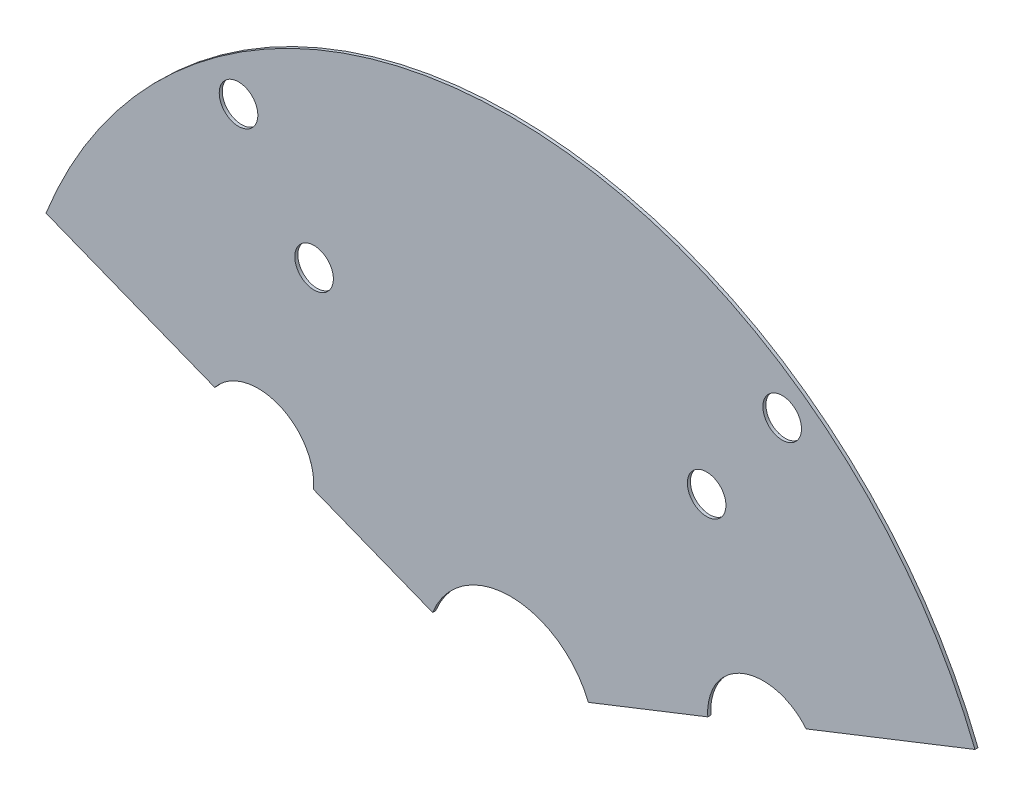
ISO-10303-21;
HEADER;
FILE_DESCRIPTION(('STEP AP214'),'2;1');
FILE_NAME('part.step','',(''),(''),'','','');
FILE_SCHEMA(('AUTOMOTIVE_DESIGN { 1 0 10303 214 1 1 1 1 }'));
ENDSEC;
DATA;
#1=APPLICATION_CONTEXT('core data for automotive mechanical design processes');
#2=APPLICATION_PROTOCOL_DEFINITION('international standard','automotive_design',2000,#1);
#3=PRODUCT_CONTEXT('',#1,'mechanical');
#4=PRODUCT('Part','Part','',(#3));
#5=PRODUCT_RELATED_PRODUCT_CATEGORY('part','',(#4));
#6=PRODUCT_DEFINITION_FORMATION('','',#4);
#7=PRODUCT_DEFINITION_CONTEXT('part definition',#1,'design');
#8=PRODUCT_DEFINITION('design','',#6,#7);
#9=PRODUCT_DEFINITION_SHAPE('','',#8);
#10=(LENGTH_UNIT() NAMED_UNIT(*) SI_UNIT(.MILLI.,.METRE.));
#11=(NAMED_UNIT(*) PLANE_ANGLE_UNIT() SI_UNIT($,.RADIAN.));
#12=(NAMED_UNIT(*) SI_UNIT($,.STERADIAN.) SOLID_ANGLE_UNIT());
#13=UNCERTAINTY_MEASURE_WITH_UNIT(LENGTH_MEASURE(1.E-05),#10,'distance_accuracy_value','');
#14=(GEOMETRIC_REPRESENTATION_CONTEXT(3) GLOBAL_UNCERTAINTY_ASSIGNED_CONTEXT((#13)) GLOBAL_UNIT_ASSIGNED_CONTEXT((#10,
#11,#12)) REPRESENTATION_CONTEXT('',''));
#15=CARTESIAN_POINT('',(0.,0.,0.));
#16=DIRECTION('',(0.,0.,1.));
#17=DIRECTION('',(1.,0.,0.));
#18=AXIS2_PLACEMENT_3D('',#15,#16,#17);
#19=CARTESIAN_POINT('',(7.67906470511984,3.02935475878654,0.3));
#20=DIRECTION('',(-0.366972108877837,0.930231944896407,0.));
#21=DIRECTION('',(-0.930231944896407,-0.366972108877837,0.));
#22=AXIS2_PLACEMENT_3D('',#19,#20,#21);
#23=PLANE('',#22);
#24=DIRECTION('',(0.930231944896407,0.366972108877837,0.));
#25=VECTOR('',#24,1.);
#26=CARTESIAN_POINT('',(7.67906470511984,3.02935475878654,0.3));
#27=LINE('',#26,#25);
#28=CARTESIAN_POINT('',(29.1791488489543,11.5110364109819,0.3));
#29=VERTEX_POINT('',#28);
#30=CARTESIAN_POINT('',(45.8381093167154,18.0829176370643,0.3));
#31=VERTEX_POINT('',#30);
#32=EDGE_CURVE('E108',#29,#31,#27,.T.);
#33=ORIENTED_EDGE('',*,*,#32,.F.);
#34=DIRECTION('',(0.,0.,-1.));
#35=VECTOR('',#34,1.);
#36=CARTESIAN_POINT('',(29.1791488489543,11.5110364109819,0.3));
#37=LINE('',#36,#35);
#38=CARTESIAN_POINT('',(29.1791488489543,11.5110364109819,0.));
#39=VERTEX_POINT('',#38);
#40=EDGE_CURVE('E96',#29,#39,#37,.T.);
#41=ORIENTED_EDGE('',*,*,#40,.T.);
#42=DIRECTION('',(0.930231944896407,0.366972108877837,0.));
#43=VECTOR('',#42,1.);
#44=CARTESIAN_POINT('',(7.67906470511984,3.02935475878654,0.));
#45=LINE('',#44,#43);
#46=CARTESIAN_POINT('',(45.8381093167154,18.0829176370643,0.));
#47=VERTEX_POINT('',#46);
#48=EDGE_CURVE('E132',#39,#47,#45,.T.);
#49=ORIENTED_EDGE('',*,*,#48,.T.);
#50=DIRECTION('',(0.,0.,-1.));
#51=VECTOR('',#50,1.);
#52=CARTESIAN_POINT('',(45.8381093167154,18.0829176370643,0.3));
#53=LINE('',#52,#51);
#54=EDGE_CURVE('E41',#31,#47,#53,.T.);
#55=ORIENTED_EDGE('',*,*,#54,.F.);
#56=EDGE_LOOP('',(#33,#41,#49,#55));
#57=FACE_BOUND('',#56,.T.);
#58=ADVANCED_FACE('F33',(#57),#23,.F.);
#59=CARTESIAN_POINT('',(-7.67906470511984,3.02935475878654,0.3));
#60=DIRECTION('',(0.366972108877837,0.930231944896407,0.));
#61=DIRECTION('',(-0.930231944896408,0.366972108877837,0.));
#62=AXIS2_PLACEMENT_3D('',#59,#60,#61);
#63=PLANE('',#62);
#64=DIRECTION('',(0.930231944896407,-0.366972108877837,0.));
#65=VECTOR('',#64,1.);
#66=CARTESIAN_POINT('',(-7.67906470511984,3.02935475878654,0.3));
#67=LINE('',#66,#65);
#68=CARTESIAN_POINT('',(-19.4254923376697,7.66326498273369,0.3));
#69=VERTEX_POINT('',#68);
#70=CARTESIAN_POINT('',(-7.67906470511984,3.02935475878654,0.3));
#71=VERTEX_POINT('',#70);
#72=EDGE_CURVE('E123',#69,#71,#67,.T.);
#73=ORIENTED_EDGE('',*,*,#72,.F.);
#74=DIRECTION('',(0.,0.,-1.));
#75=VECTOR('',#74,1.);
#76=CARTESIAN_POINT('',(-19.4254923376697,7.66326498273369,0.3));
#77=LINE('',#76,#75);
#78=CARTESIAN_POINT('',(-19.4254923376697,7.66326498273369,0.));
#79=VERTEX_POINT('',#78);
#80=EDGE_CURVE('E154',#69,#79,#77,.T.);
#81=ORIENTED_EDGE('',*,*,#80,.T.);
#82=DIRECTION('',(0.930231944896407,-0.366972108877837,0.));
#83=VECTOR('',#82,1.);
#84=CARTESIAN_POINT('',(-7.67906470511984,3.02935475878654,0.));
#85=LINE('',#84,#83);
#86=CARTESIAN_POINT('',(-7.67906470511984,3.02935475878654,0.));
#87=VERTEX_POINT('',#86);
#88=EDGE_CURVE('E134',#79,#87,#85,.T.);
#89=ORIENTED_EDGE('',*,*,#88,.T.);
#90=DIRECTION('',(0.,0.,-1.));
#91=VECTOR('',#90,1.);
#92=CARTESIAN_POINT('',(-7.67906470511984,3.02935475878654,0.3));
#93=LINE('',#92,#91);
#94=EDGE_CURVE('E127',#71,#87,#93,.T.);
#95=ORIENTED_EDGE('',*,*,#94,.F.);
#96=EDGE_LOOP('',(#73,#81,#89,#95));
#97=FACE_BOUND('',#96,.T.);
#98=ADVANCED_FACE('F209',(#97),#63,.F.);
#99=CARTESIAN_POINT('',(7.67906470511984,3.02935475878654,0.));
#100=VERTEX_POINT('',#99);
#101=CARTESIAN_POINT('',(19.4682469547699,7.68013147725434,0.));
#102=VERTEX_POINT('',#101);
#103=EDGE_CURVE('E128',#100,#102,#45,.T.);
#104=ORIENTED_EDGE('',*,*,#103,.T.);
#105=DIRECTION('',(0.,0.,-1.));
#106=VECTOR('',#105,1.);
#107=CARTESIAN_POINT('',(19.4682469547699,7.68013147725434,0.3));
#108=LINE('',#107,#106);
#109=CARTESIAN_POINT('',(19.4682469547699,7.68013147725434,0.3));
#110=VERTEX_POINT('',#109);
#111=EDGE_CURVE('E56',#110,#102,#108,.T.);
#112=ORIENTED_EDGE('',*,*,#111,.F.);
#113=CARTESIAN_POINT('',(7.67906470511984,3.02935475878654,0.3));
#114=VERTEX_POINT('',#113);
#115=EDGE_CURVE('E111',#114,#110,#27,.T.);
#116=ORIENTED_EDGE('',*,*,#115,.F.);
#117=DIRECTION('',(0.,0.,-1.));
#118=VECTOR('',#117,1.);
#119=CARTESIAN_POINT('',(7.67906470511984,3.02935475878654,0.3));
#120=LINE('',#119,#118);
#121=EDGE_CURVE('E11',#114,#100,#120,.T.);
#122=ORIENTED_EDGE('',*,*,#121,.T.);
#123=EDGE_LOOP('',(#104,#112,#116,#122));
#124=FACE_BOUND('',#123,.T.);
#125=ADVANCED_FACE('F35',(#124),#23,.F.);
#126=CARTESIAN_POINT('',(0.,0.,0.3));
#127=DIRECTION('',(0.,0.,-1.));
#128=DIRECTION('',(-1.,0.,0.));
#129=AXIS2_PLACEMENT_3D('',#126,#127,#128);
#130=CYLINDRICAL_SURFACE('',#129,49.276);
#131=CARTESIAN_POINT('',(0.,0.,0.));
#132=DIRECTION('',(0.,0.,1.));
#133=DIRECTION('',(1.,0.,0.));
#134=AXIS2_PLACEMENT_3D('',#131,#132,#133);
#135=CIRCLE('',#134,49.276);
#136=CARTESIAN_POINT('',(-45.8381093167154,18.0829176370643,0.));
#137=VERTEX_POINT('',#136);
#138=EDGE_CURVE('E131',#47,#137,#135,.T.);
#139=ORIENTED_EDGE('',*,*,#138,.T.);
#140=DIRECTION('',(0.,0.,-1.));
#141=VECTOR('',#140,1.);
#142=CARTESIAN_POINT('',(-45.8381093167154,18.0829176370643,0.3));
#143=LINE('',#142,#141);
#144=CARTESIAN_POINT('',(-45.8381093167154,18.0829176370643,0.3));
#145=VERTEX_POINT('',#144);
#146=EDGE_CURVE('E141',#145,#137,#143,.T.);
#147=ORIENTED_EDGE('',*,*,#146,.F.);
#148=CARTESIAN_POINT('',(0.,0.,0.3));
#149=DIRECTION('',(0.,0.,1.));
#150=DIRECTION('',(-1.,0.,0.));
#151=AXIS2_PLACEMENT_3D('',#148,#149,#150);
#152=CIRCLE('',#151,49.276);
#153=EDGE_CURVE('E117',#31,#145,#152,.T.);
#154=ORIENTED_EDGE('',*,*,#153,.F.);
#155=ORIENTED_EDGE('',*,*,#54,.T.);
#156=EDGE_LOOP('',(#139,#147,#154,#155));
#157=FACE_BOUND('',#156,.T.);
#158=ADVANCED_FACE('F144',(#157),#130,.T.);
#159=CARTESIAN_POINT('',(-29.1834364355771,11.5127278436548,0.));
#160=VERTEX_POINT('',#159);
#161=EDGE_CURVE('E135',#137,#160,#85,.T.);
#162=ORIENTED_EDGE('',*,*,#161,.T.);
#163=DIRECTION('',(0.,0.,-1.));
#164=VECTOR('',#163,1.);
#165=CARTESIAN_POINT('',(-29.1834364355771,11.5127278436548,0.3));
#166=LINE('',#165,#164);
#167=CARTESIAN_POINT('',(-29.1834364355771,11.5127278436548,0.3));
#168=VERTEX_POINT('',#167);
#169=EDGE_CURVE('E48',#168,#160,#166,.T.);
#170=ORIENTED_EDGE('',*,*,#169,.F.);
#171=EDGE_CURVE('E124',#145,#168,#67,.T.);
#172=ORIENTED_EDGE('',*,*,#171,.F.);
#173=ORIENTED_EDGE('',*,*,#146,.T.);
#174=EDGE_LOOP('',(#162,#170,#172,#173));
#175=FACE_BOUND('',#174,.T.);
#176=ADVANCED_FACE('F152',(#175),#63,.F.);
#177=CARTESIAN_POINT('',(0.,0.,0.3));
#178=DIRECTION('',(0.,0.,-1.));
#179=DIRECTION('',(-1.,0.,0.));
#180=AXIS2_PLACEMENT_3D('',#177,#178,#179);
#181=CYLINDRICAL_SURFACE('',#180,8.255);
#182=CARTESIAN_POINT('',(0.,0.,0.));
#183=DIRECTION('',(0.,0.,-1.));
#184=DIRECTION('',(1.,0.,0.));
#185=AXIS2_PLACEMENT_3D('',#182,#183,#184);
#186=CIRCLE('',#185,8.255);
#187=EDGE_CURVE('E118',#87,#100,#186,.T.);
#188=ORIENTED_EDGE('',*,*,#187,.T.);
#189=ORIENTED_EDGE('',*,*,#121,.F.);
#190=CARTESIAN_POINT('',(0.,0.,0.3));
#191=DIRECTION('',(0.,0.,-1.));
#192=DIRECTION('',(-1.,0.,0.));
#193=AXIS2_PLACEMENT_3D('',#190,#191,#192);
#194=CIRCLE('',#193,8.255);
#195=EDGE_CURVE('E115',#71,#114,#194,.T.);
#196=ORIENTED_EDGE('',*,*,#195,.F.);
#197=ORIENTED_EDGE('',*,*,#94,.T.);
#198=EDGE_LOOP('',(#188,#189,#196,#197));
#199=FACE_BOUND('',#198,.T.);
#200=ADVANCED_FACE('F230',(#199),#181,.F.);
#201=CARTESIAN_POINT('',(0.,0.,0.3));
#202=DIRECTION('',(0.,0.,-1.));
#203=DIRECTION('',(-1.,0.,0.));
#204=AXIS2_PLACEMENT_3D('',#201,#202,#203);
#205=PLANE('',#204);
#206=CARTESIAN_POINT('',(26.8138563269618,36.9191576908308,0.3));
#207=DIRECTION('',(0.,0.,-1.));
#208=DIRECTION('',(-1.,0.,0.));
#209=AXIS2_PLACEMENT_3D('',#206,#207,#208);
#210=CIRCLE('',#209,1.90500000000001);
#211=CARTESIAN_POINT('',(24.9088563269618,36.9191576908308,0.3));
#212=VERTEX_POINT('',#211);
#213=EDGE_CURVE('E163',#212,#212,#210,.T.);
#214=ORIENTED_EDGE('',*,*,#213,.T.);
#215=EDGE_LOOP('',(#214));
#216=FACE_BOUND('',#215,.T.);
#217=CARTESIAN_POINT('',(-19.3835749327433,26.6397061582739,0.3));
#218=DIRECTION('',(0.,0.,-1.));
#219=DIRECTION('',(-1.,0.,0.));
#220=AXIS2_PLACEMENT_3D('',#217,#218,#219);
#221=CIRCLE('',#220,1.90500000000001);
#222=CARTESIAN_POINT('',(-21.2885749327433,26.6397061582739,0.3));
#223=VERTEX_POINT('',#222);
#224=EDGE_CURVE('E170',#223,#223,#221,.T.);
#225=ORIENTED_EDGE('',*,*,#224,.T.);
#226=EDGE_LOOP('',(#225));
#227=FACE_BOUND('',#226,.T.);
#228=CARTESIAN_POINT('',(-26.8388408160422,36.9009993323523,0.3));
#229=DIRECTION('',(0.,0.,-1.));
#230=DIRECTION('',(-1.,0.,0.));
#231=AXIS2_PLACEMENT_3D('',#228,#229,#230);
#232=CIRCLE('',#231,1.90499999999999);
#233=CARTESIAN_POINT('',(-28.7438408160422,36.9009993323523,0.3));
#234=VERTEX_POINT('',#233);
#235=EDGE_CURVE('E182',#234,#234,#232,.T.);
#236=ORIENTED_EDGE('',*,*,#235,.T.);
#237=EDGE_LOOP('',(#236));
#238=FACE_BOUND('',#237,.T.);
#239=CARTESIAN_POINT('',(19.3585904436626,26.6578645167526,0.3));
#240=DIRECTION('',(0.,0.,-1.));
#241=DIRECTION('',(-1.,0.,0.));
#242=AXIS2_PLACEMENT_3D('',#239,#240,#241);
#243=CIRCLE('',#242,1.90500000000001);
#244=CARTESIAN_POINT('',(17.4535904436626,26.6578645167526,0.3));
#245=VERTEX_POINT('',#244);
#246=EDGE_CURVE('E169',#245,#245,#243,.T.);
#247=ORIENTED_EDGE('',*,*,#246,.T.);
#248=EDGE_LOOP('',(#247));
#249=FACE_BOUND('',#248,.T.);
#250=ORIENTED_EDGE('',*,*,#115,.T.);
#251=CARTESIAN_POINT('',(24.9443963220537,8.0221850818052,0.3));
#252=DIRECTION('',(0.,0.,-1.));
#253=DIRECTION('',(0.,1.,0.));
#254=AXIS2_PLACEMENT_3D('',#251,#252,#253);
#255=CIRCLE('',#254,5.48682171764213);
#256=EDGE_CURVE('E99',#110,#29,#255,.T.);
#257=ORIENTED_EDGE('',*,*,#256,.T.);
#258=ORIENTED_EDGE('',*,*,#32,.T.);
#259=ORIENTED_EDGE('',*,*,#153,.T.);
#260=ORIENTED_EDGE('',*,*,#171,.T.);
#261=CARTESIAN_POINT('',(-24.8957626212226,8.08912362837409,0.3));
#262=DIRECTION('',(0.,0.,-1.));
#263=DIRECTION('',(0.,1.,0.));
#264=AXIS2_PLACEMENT_3D('',#261,#262,#263);
#265=CIRCLE('',#264,5.48682171764213);
#266=EDGE_CURVE('E149',#168,#69,#265,.T.);
#267=ORIENTED_EDGE('',*,*,#266,.T.);
#268=ORIENTED_EDGE('',*,*,#72,.T.);
#269=ORIENTED_EDGE('',*,*,#195,.T.);
#270=EDGE_LOOP('',(#250,#257,#258,#259,#260,#267,#268,#269));
#271=FACE_BOUND('',#270,.T.);
#272=ADVANCED_FACE('F107',(#216,#227,#238,#249,#271),#205,.F.);
#273=CARTESIAN_POINT('',(0.,0.,0.));
#274=DIRECTION('',(0.,0.,-1.));
#275=DIRECTION('',(-1.,0.,0.));
#276=AXIS2_PLACEMENT_3D('',#273,#274,#275);
#277=PLANE('',#276);
#278=CARTESIAN_POINT('',(24.9443963220537,8.0221850818052,0.));
#279=DIRECTION('',(0.,0.,-1.));
#280=DIRECTION('',(0.,1.,0.));
#281=AXIS2_PLACEMENT_3D('',#278,#279,#280);
#282=CIRCLE('',#281,5.48682171764213);
#283=EDGE_CURVE('E100',#102,#39,#282,.T.);
#284=ORIENTED_EDGE('',*,*,#283,.F.);
#285=ORIENTED_EDGE('',*,*,#103,.F.);
#286=ORIENTED_EDGE('',*,*,#187,.F.);
#287=ORIENTED_EDGE('',*,*,#88,.F.);
#288=CARTESIAN_POINT('',(-24.8957626212226,8.08912362837409,0.));
#289=DIRECTION('',(0.,0.,-1.));
#290=DIRECTION('',(0.,1.,0.));
#291=AXIS2_PLACEMENT_3D('',#288,#289,#290);
#292=CIRCLE('',#291,5.48682171764213);
#293=EDGE_CURVE('E160',#160,#79,#292,.T.);
#294=ORIENTED_EDGE('',*,*,#293,.F.);
#295=ORIENTED_EDGE('',*,*,#161,.F.);
#296=ORIENTED_EDGE('',*,*,#138,.F.);
#297=ORIENTED_EDGE('',*,*,#48,.F.);
#298=EDGE_LOOP('',(#284,#285,#286,#287,#294,#295,#296,#297));
#299=FACE_BOUND('',#298,.T.);
#300=CARTESIAN_POINT('',(26.8138563269618,36.9191576908308,0.));
#301=DIRECTION('',(0.,0.,-1.));
#302=DIRECTION('',(-1.,0.,0.));
#303=AXIS2_PLACEMENT_3D('',#300,#301,#302);
#304=CIRCLE('',#303,1.90500000000001);
#305=CARTESIAN_POINT('',(24.9088563269618,36.9191576908308,0.));
#306=VERTEX_POINT('',#305);
#307=EDGE_CURVE('E166',#306,#306,#304,.T.);
#308=ORIENTED_EDGE('',*,*,#307,.F.);
#309=EDGE_LOOP('',(#308));
#310=FACE_BOUND('',#309,.T.);
#311=CARTESIAN_POINT('',(-19.3835749327433,26.6397061582739,0.));
#312=DIRECTION('',(0.,0.,-1.));
#313=DIRECTION('',(-1.,0.,0.));
#314=AXIS2_PLACEMENT_3D('',#311,#312,#313);
#315=CIRCLE('',#314,1.90500000000001);
#316=CARTESIAN_POINT('',(-21.2885749327433,26.6397061582739,0.));
#317=VERTEX_POINT('',#316);
#318=EDGE_CURVE('E174',#317,#317,#315,.T.);
#319=ORIENTED_EDGE('',*,*,#318,.F.);
#320=EDGE_LOOP('',(#319));
#321=FACE_BOUND('',#320,.T.);
#322=CARTESIAN_POINT('',(-26.8388408160422,36.9009993323523,0.));
#323=DIRECTION('',(0.,0.,-1.));
#324=DIRECTION('',(-1.,0.,0.));
#325=AXIS2_PLACEMENT_3D('',#322,#323,#324);
#326=CIRCLE('',#325,1.90499999999999);
#327=CARTESIAN_POINT('',(-28.7438408160422,36.9009993323523,0.));
#328=VERTEX_POINT('',#327);
#329=EDGE_CURVE('E173',#328,#328,#326,.T.);
#330=ORIENTED_EDGE('',*,*,#329,.F.);
#331=EDGE_LOOP('',(#330));
#332=FACE_BOUND('',#331,.T.);
#333=CARTESIAN_POINT('',(19.3585904436626,26.6578645167526,0.));
#334=DIRECTION('',(0.,0.,-1.));
#335=DIRECTION('',(-1.,0.,0.));
#336=AXIS2_PLACEMENT_3D('',#333,#334,#335);
#337=CIRCLE('',#336,1.90500000000001);
#338=CARTESIAN_POINT('',(17.4535904436626,26.6578645167526,0.));
#339=VERTEX_POINT('',#338);
#340=EDGE_CURVE('E179',#339,#339,#337,.T.);
#341=ORIENTED_EDGE('',*,*,#340,.F.);
#342=EDGE_LOOP('',(#341));
#343=FACE_BOUND('',#342,.T.);
#344=ADVANCED_FACE('F189',(#299,#310,#321,#332,#343),#277,.T.);
#345=CARTESIAN_POINT('',(19.3585904436626,26.6578645167526,0.3));
#346=DIRECTION('',(0.,0.,-1.));
#347=DIRECTION('',(-1.,0.,0.));
#348=AXIS2_PLACEMENT_3D('',#345,#346,#347);
#349=CYLINDRICAL_SURFACE('',#348,1.90500000000001);
#350=ORIENTED_EDGE('',*,*,#246,.F.);
#351=EDGE_LOOP('',(#350));
#352=FACE_BOUND('',#351,.T.);
#353=ORIENTED_EDGE('',*,*,#340,.T.);
#354=EDGE_LOOP('',(#353));
#355=FACE_BOUND('',#354,.T.);
#356=ADVANCED_FACE('F192',(#352,#355),#349,.F.);
#357=CARTESIAN_POINT('',(-26.8388408160422,36.9009993323523,0.3));
#358=DIRECTION('',(0.,0.,-1.));
#359=DIRECTION('',(-1.,0.,0.));
#360=AXIS2_PLACEMENT_3D('',#357,#358,#359);
#361=CYLINDRICAL_SURFACE('',#360,1.90499999999999);
#362=ORIENTED_EDGE('',*,*,#235,.F.);
#363=EDGE_LOOP('',(#362));
#364=FACE_BOUND('',#363,.T.);
#365=ORIENTED_EDGE('',*,*,#329,.T.);
#366=EDGE_LOOP('',(#365));
#367=FACE_BOUND('',#366,.T.);
#368=ADVANCED_FACE('F187',(#364,#367),#361,.F.);
#369=CARTESIAN_POINT('',(-19.3835749327433,26.6397061582739,0.3));
#370=DIRECTION('',(0.,0.,-1.));
#371=DIRECTION('',(-1.,0.,0.));
#372=AXIS2_PLACEMENT_3D('',#369,#370,#371);
#373=CYLINDRICAL_SURFACE('',#372,1.90500000000001);
#374=ORIENTED_EDGE('',*,*,#224,.F.);
#375=EDGE_LOOP('',(#374));
#376=FACE_BOUND('',#375,.T.);
#377=ORIENTED_EDGE('',*,*,#318,.T.);
#378=EDGE_LOOP('',(#377));
#379=FACE_BOUND('',#378,.T.);
#380=ADVANCED_FACE('F203',(#376,#379),#373,.F.);
#381=CARTESIAN_POINT('',(26.8138563269618,36.9191576908308,0.3));
#382=DIRECTION('',(0.,0.,-1.));
#383=DIRECTION('',(-1.,0.,0.));
#384=AXIS2_PLACEMENT_3D('',#381,#382,#383);
#385=CYLINDRICAL_SURFACE('',#384,1.90500000000001);
#386=ORIENTED_EDGE('',*,*,#213,.F.);
#387=EDGE_LOOP('',(#386));
#388=FACE_BOUND('',#387,.T.);
#389=ORIENTED_EDGE('',*,*,#307,.T.);
#390=EDGE_LOOP('',(#389));
#391=FACE_BOUND('',#390,.T.);
#392=ADVANCED_FACE('F273',(#388,#391),#385,.F.);
#393=CARTESIAN_POINT('',(-24.8957626212226,8.08912362837409,0.3));
#394=DIRECTION('',(0.,0.,-1.));
#395=DIRECTION('',(0.,1.,0.));
#396=AXIS2_PLACEMENT_3D('',#393,#394,#395);
#397=CYLINDRICAL_SURFACE('',#396,5.48682171764213);
#398=ORIENTED_EDGE('',*,*,#293,.T.);
#399=ORIENTED_EDGE('',*,*,#80,.F.);
#400=ORIENTED_EDGE('',*,*,#266,.F.);
#401=ORIENTED_EDGE('',*,*,#169,.T.);
#402=EDGE_LOOP('',(#398,#399,#400,#401));
#403=FACE_BOUND('',#402,.T.);
#404=ADVANCED_FACE('F226',(#403),#397,.F.);
#405=CARTESIAN_POINT('',(24.9443963220537,8.0221850818052,0.3));
#406=DIRECTION('',(0.,0.,-1.));
#407=DIRECTION('',(0.,1.,0.));
#408=AXIS2_PLACEMENT_3D('',#405,#406,#407);
#409=CYLINDRICAL_SURFACE('',#408,5.48682171764213);
#410=ORIENTED_EDGE('',*,*,#283,.T.);
#411=ORIENTED_EDGE('',*,*,#40,.F.);
#412=ORIENTED_EDGE('',*,*,#256,.F.);
#413=ORIENTED_EDGE('',*,*,#111,.T.);
#414=EDGE_LOOP('',(#410,#411,#412,#413));
#415=FACE_BOUND('',#414,.T.);
#416=ADVANCED_FACE('F98',(#415),#409,.F.);
#417=CLOSED_SHELL('',(#58,#98,#125,#158,#176,#200,#272,#344,#356,#368,#380,#392,#404,#416));
#418=MANIFOLD_SOLID_BREP('B2',#417);
#419=ADVANCED_BREP_SHAPE_REPRESENTATION('',(#18,#418),#14);
#420=SHAPE_DEFINITION_REPRESENTATION(#9,#419);
ENDSEC;
END-ISO-10303-21;
